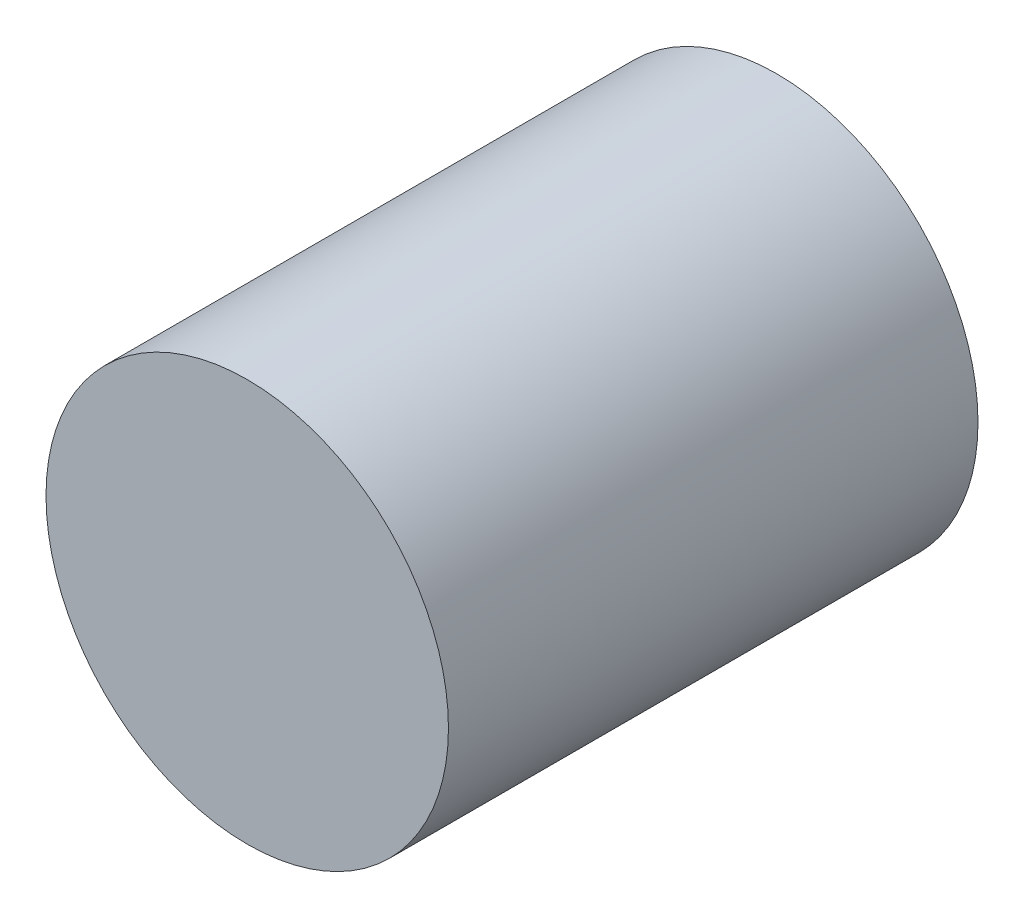
ISO-10303-21;
HEADER;
FILE_DESCRIPTION(('STEP AP214'),'2;1');
FILE_NAME('part.step','',(''),(''),'','','');
FILE_SCHEMA(('AUTOMOTIVE_DESIGN { 1 0 10303 214 1 1 1 1 }'));
ENDSEC;
DATA;
#1=APPLICATION_CONTEXT('core data for automotive mechanical design processes');
#2=APPLICATION_PROTOCOL_DEFINITION('international standard','automotive_design',2000,#1);
#3=PRODUCT_CONTEXT('',#1,'mechanical');
#4=PRODUCT('Part','Part','',(#3));
#5=PRODUCT_RELATED_PRODUCT_CATEGORY('part','',(#4));
#6=PRODUCT_DEFINITION_FORMATION('','',#4);
#7=PRODUCT_DEFINITION_CONTEXT('part definition',#1,'design');
#8=PRODUCT_DEFINITION('design','',#6,#7);
#9=PRODUCT_DEFINITION_SHAPE('','',#8);
#10=(LENGTH_UNIT() NAMED_UNIT(*) SI_UNIT(.MILLI.,.METRE.));
#11=(NAMED_UNIT(*) PLANE_ANGLE_UNIT() SI_UNIT($,.RADIAN.));
#12=(NAMED_UNIT(*) SI_UNIT($,.STERADIAN.) SOLID_ANGLE_UNIT());
#13=UNCERTAINTY_MEASURE_WITH_UNIT(LENGTH_MEASURE(1.E-05),#10,'distance_accuracy_value','');
#14=(GEOMETRIC_REPRESENTATION_CONTEXT(3) GLOBAL_UNCERTAINTY_ASSIGNED_CONTEXT((#13)) GLOBAL_UNIT_ASSIGNED_CONTEXT((#10,
#11,#12)) REPRESENTATION_CONTEXT('',''));
#15=CARTESIAN_POINT('',(0.,0.,0.));
#16=DIRECTION('',(0.,0.,1.));
#17=DIRECTION('',(1.,0.,0.));
#18=AXIS2_PLACEMENT_3D('',#15,#16,#17);
#19=CARTESIAN_POINT('',(0.,0.,12.7));
#20=DIRECTION('',(0.,0.,-1.));
#21=DIRECTION('',(-1.,0.,0.));
#22=AXIS2_PLACEMENT_3D('',#19,#20,#21);
#23=CYLINDRICAL_SURFACE('',#22,4.826);
#24=CARTESIAN_POINT('',(0.,0.,12.7));
#25=DIRECTION('',(0.,0.,1.));
#26=DIRECTION('',(1.,0.,0.));
#27=AXIS2_PLACEMENT_3D('',#24,#25,#26);
#28=CIRCLE('',#27,4.826);
#29=CARTESIAN_POINT('',(4.826,0.,12.7));
#30=VERTEX_POINT('',#29);
#31=EDGE_CURVE('E10',#30,#30,#28,.T.);
#32=ORIENTED_EDGE('',*,*,#31,.F.);
#33=EDGE_LOOP('',(#32));
#34=FACE_BOUND('',#33,.T.);
#35=CARTESIAN_POINT('',(0.,0.,0.));
#36=DIRECTION('',(0.,0.,1.));
#37=DIRECTION('',(1.,0.,0.));
#38=AXIS2_PLACEMENT_3D('',#35,#36,#37);
#39=CIRCLE('',#38,4.826);
#40=CARTESIAN_POINT('',(4.826,0.,0.));
#41=VERTEX_POINT('',#40);
#42=EDGE_CURVE('E46',#41,#41,#39,.T.);
#43=ORIENTED_EDGE('',*,*,#42,.T.);
#44=EDGE_LOOP('',(#43));
#45=FACE_BOUND('',#44,.T.);
#46=ADVANCED_FACE('F43',(#34,#45),#23,.T.);
#47=CARTESIAN_POINT('',(0.,0.,12.7));
#48=DIRECTION('',(0.,0.,1.));
#49=DIRECTION('',(1.,0.,0.));
#50=AXIS2_PLACEMENT_3D('',#47,#48,#49);
#51=PLANE('',#50);
#52=ORIENTED_EDGE('',*,*,#31,.T.);
#53=EDGE_LOOP('',(#52));
#54=FACE_BOUND('',#53,.T.);
#55=ADVANCED_FACE('F60',(#54),#51,.T.);
#56=CARTESIAN_POINT('',(0.,0.,0.));
#57=DIRECTION('',(0.,0.,1.));
#58=DIRECTION('',(1.,0.,0.));
#59=AXIS2_PLACEMENT_3D('',#56,#57,#58);
#60=PLANE('',#59);
#61=ORIENTED_EDGE('',*,*,#42,.F.);
#62=EDGE_LOOP('',(#61));
#63=FACE_BOUND('',#62,.T.);
#64=ADVANCED_FACE('F58',(#63),#60,.F.);
#65=CLOSED_SHELL('',(#46,#55,#64));
#66=MANIFOLD_SOLID_BREP('B2',#65);
#67=ADVANCED_BREP_SHAPE_REPRESENTATION('',(#18,#66),#14);
#68=SHAPE_DEFINITION_REPRESENTATION(#9,#67);
ENDSEC;
END-ISO-10303-21;
